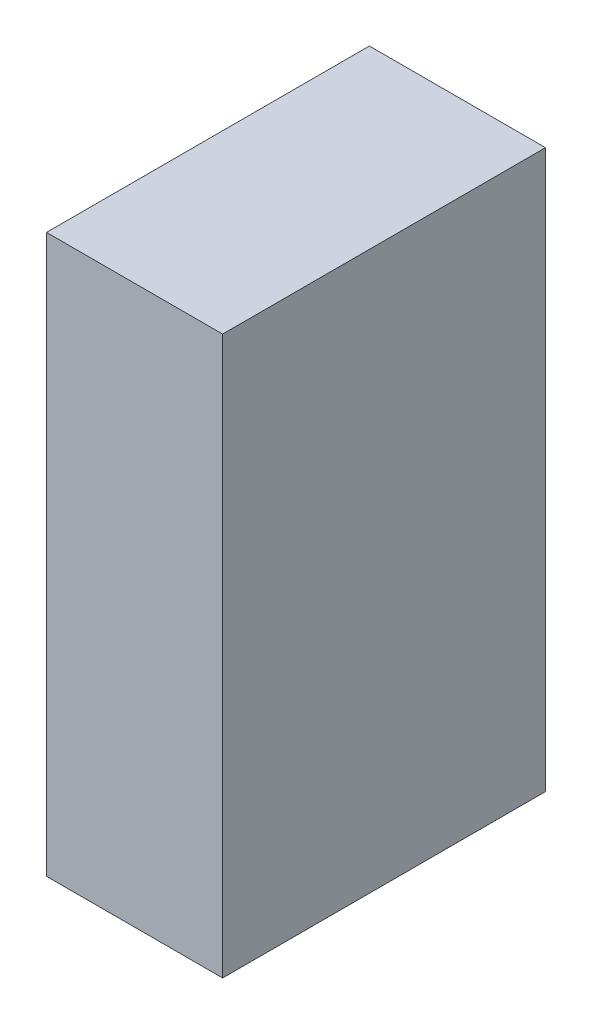
ISO-10303-21;
HEADER;
FILE_DESCRIPTION(('STEP AP214'),'2;1');
FILE_NAME('part.step','',(''),(''),'','','');
FILE_SCHEMA(('AUTOMOTIVE_DESIGN { 1 0 10303 214 1 1 1 1 }'));
ENDSEC;
DATA;
#1=APPLICATION_CONTEXT('core data for automotive mechanical design processes');
#2=APPLICATION_PROTOCOL_DEFINITION('international standard','automotive_design',2000,#1);
#3=PRODUCT_CONTEXT('',#1,'mechanical');
#4=PRODUCT('Part','Part','',(#3));
#5=PRODUCT_RELATED_PRODUCT_CATEGORY('part','',(#4));
#6=PRODUCT_DEFINITION_FORMATION('','',#4);
#7=PRODUCT_DEFINITION_CONTEXT('part definition',#1,'design');
#8=PRODUCT_DEFINITION('design','',#6,#7);
#9=PRODUCT_DEFINITION_SHAPE('','',#8);
#10=(LENGTH_UNIT() NAMED_UNIT(*) SI_UNIT(.MILLI.,.METRE.));
#11=(NAMED_UNIT(*) PLANE_ANGLE_UNIT() SI_UNIT($,.RADIAN.));
#12=(NAMED_UNIT(*) SI_UNIT($,.STERADIAN.) SOLID_ANGLE_UNIT());
#13=UNCERTAINTY_MEASURE_WITH_UNIT(LENGTH_MEASURE(1.E-05),#10,'distance_accuracy_value','');
#14=(GEOMETRIC_REPRESENTATION_CONTEXT(3) GLOBAL_UNCERTAINTY_ASSIGNED_CONTEXT((#13)) GLOBAL_UNIT_ASSIGNED_CONTEXT((#10,
#11,#12)) REPRESENTATION_CONTEXT('',''));
#15=CARTESIAN_POINT('',(0.,0.,0.));
#16=DIRECTION('',(0.,0.,1.));
#17=DIRECTION('',(1.,0.,0.));
#18=AXIS2_PLACEMENT_3D('',#15,#16,#17);
#19=CARTESIAN_POINT('',(54.649987932969,17.199991504727,-0.961478888988));
#20=DIRECTION('',(-1.,0.,0.));
#21=DIRECTION('',(0.,0.,1.));
#22=AXIS2_PLACEMENT_3D('',#19,#20,#21);
#23=PLANE('',#22);
#24=DIRECTION('',(0.,0.,1.));
#25=VECTOR('',#24,1.);
#26=CARTESIAN_POINT('',(54.649987932969,18.149992144727,-0.961478888988));
#27=LINE('',#26,#25);
#28=CARTESIAN_POINT('',(54.649987932969,18.149992144727,-0.961478888988));
#29=VERTEX_POINT('',#28);
#30=CARTESIAN_POINT('',(54.649987932969,18.149992144727,-0.411479988988));
#31=VERTEX_POINT('',#30);
#32=EDGE_CURVE('E20',#29,#31,#27,.T.);
#33=ORIENTED_EDGE('',*,*,#32,.F.);
#34=DIRECTION('',(0.,1.,0.));
#35=VECTOR('',#34,1.);
#36=CARTESIAN_POINT('',(54.649987932969,17.674991824727,-0.961478888988));
#37=LINE('',#36,#35);
#38=CARTESIAN_POINT('',(54.649987932969,17.199991504727,-0.961478888988));
#39=VERTEX_POINT('',#38);
#40=EDGE_CURVE('E80',#39,#29,#37,.T.);
#41=ORIENTED_EDGE('',*,*,#40,.F.);
#42=DIRECTION('',(0.,0.,-1.));
#43=VECTOR('',#42,1.);
#44=CARTESIAN_POINT('',(54.649987932969,17.199991504727,-0.961478888988));
#45=LINE('',#44,#43);
#46=CARTESIAN_POINT('',(54.649987932969,17.199991504727,-0.411479988988));
#47=VERTEX_POINT('',#46);
#48=EDGE_CURVE('E61',#47,#39,#45,.T.);
#49=ORIENTED_EDGE('',*,*,#48,.F.);
#50=DIRECTION('',(0.,1.,0.));
#51=VECTOR('',#50,1.);
#52=CARTESIAN_POINT('',(54.649987932969,17.674991824727,-0.411479988988));
#53=LINE('',#52,#51);
#54=EDGE_CURVE('E55',#47,#31,#53,.T.);
#55=ORIENTED_EDGE('',*,*,#54,.T.);
#56=EDGE_LOOP('',(#33,#41,#49,#55));
#57=FACE_BOUND('',#56,.T.);
#58=ADVANCED_FACE('F17',(#57),#23,.T.);
#59=CARTESIAN_POINT('',(54.649987932969,18.149992144727,-0.961478888988));
#60=DIRECTION('',(0.,1.,0.));
#61=DIRECTION('',(0.,0.,1.));
#62=AXIS2_PLACEMENT_3D('',#59,#60,#61);
#63=PLANE('',#62);
#64=DIRECTION('',(0.,0.,-1.));
#65=VECTOR('',#64,1.);
#66=CARTESIAN_POINT('',(54.949987332969,18.149992144727,-0.961478888988));
#67=LINE('',#66,#65);
#68=CARTESIAN_POINT('',(54.949987332969,18.149992144727,-0.961478888988));
#69=VERTEX_POINT('',#68);
#70=CARTESIAN_POINT('',(54.949987332969,18.149992144727,-0.411479988988));
#71=VERTEX_POINT('',#70);
#72=EDGE_CURVE('E83',#69,#71,#67,.F.);
#73=ORIENTED_EDGE('',*,*,#72,.F.);
#74=DIRECTION('',(-1.,0.,0.));
#75=VECTOR('',#74,1.);
#76=CARTESIAN_POINT('',(54.799987632969,18.149992144727,-0.961478888988));
#77=LINE('',#76,#75);
#78=EDGE_CURVE('E68',#29,#69,#77,.F.);
#79=ORIENTED_EDGE('',*,*,#78,.F.);
#80=ORIENTED_EDGE('',*,*,#32,.T.);
#81=DIRECTION('',(-1.,0.,0.));
#82=VECTOR('',#81,1.);
#83=CARTESIAN_POINT('',(54.799987632969,18.149992144727,-0.411479988988));
#84=LINE('',#83,#82);
#85=EDGE_CURVE('E63',#31,#71,#84,.F.);
#86=ORIENTED_EDGE('',*,*,#85,.T.);
#87=EDGE_LOOP('',(#73,#79,#80,#86));
#88=FACE_BOUND('',#87,.T.);
#89=ADVANCED_FACE('F65',(#88),#63,.T.);
#90=CARTESIAN_POINT('',(54.799987632969,17.674991824727,-0.411479988988));
#91=DIRECTION('',(0.,0.,-1.));
#92=DIRECTION('',(-1.,0.,0.));
#93=AXIS2_PLACEMENT_3D('',#90,#91,#92);
#94=PLANE('',#93);
#95=ORIENTED_EDGE('',*,*,#54,.F.);
#96=DIRECTION('',(1.,0.,0.));
#97=VECTOR('',#96,1.);
#98=CARTESIAN_POINT('',(54.949987332969,17.199991504727,-0.411479988988));
#99=LINE('',#98,#97);
#100=CARTESIAN_POINT('',(54.949987332969,17.199991504727,-0.411479988988));
#101=VERTEX_POINT('',#100);
#102=EDGE_CURVE('E74',#101,#47,#99,.F.);
#103=ORIENTED_EDGE('',*,*,#102,.F.);
#104=DIRECTION('',(0.,1.,0.));
#105=VECTOR('',#104,1.);
#106=CARTESIAN_POINT('',(54.949987332969,18.149992144727,-0.411479988988));
#107=LINE('',#106,#105);
#108=EDGE_CURVE('E72',#71,#101,#107,.F.);
#109=ORIENTED_EDGE('',*,*,#108,.F.);
#110=ORIENTED_EDGE('',*,*,#85,.F.);
#111=EDGE_LOOP('',(#95,#103,#109,#110));
#112=FACE_BOUND('',#111,.T.);
#113=ADVANCED_FACE('F70',(#112),#94,.F.);
#114=CARTESIAN_POINT('',(54.949987332969,17.199991504727,-0.961478888988));
#115=DIRECTION('',(0.,-1.,0.));
#116=DIRECTION('',(0.,0.,-1.));
#117=AXIS2_PLACEMENT_3D('',#114,#115,#116);
#118=PLANE('',#117);
#119=ORIENTED_EDGE('',*,*,#48,.T.);
#120=DIRECTION('',(-1.,0.,0.));
#121=VECTOR('',#120,1.);
#122=CARTESIAN_POINT('',(54.799987632969,17.199991504727,-0.961478888988));
#123=LINE('',#122,#121);
#124=CARTESIAN_POINT('',(54.949987332969,17.199991504727,-0.961478888988));
#125=VERTEX_POINT('',#124);
#126=EDGE_CURVE('E35',#125,#39,#123,.T.);
#127=ORIENTED_EDGE('',*,*,#126,.F.);
#128=DIRECTION('',(0.,0.,-1.));
#129=VECTOR('',#128,1.);
#130=CARTESIAN_POINT('',(54.949987332969,17.199991504727,-0.961478888988));
#131=LINE('',#130,#129);
#132=EDGE_CURVE('E26',#101,#125,#131,.T.);
#133=ORIENTED_EDGE('',*,*,#132,.F.);
#134=ORIENTED_EDGE('',*,*,#102,.T.);
#135=EDGE_LOOP('',(#119,#127,#133,#134));
#136=FACE_BOUND('',#135,.T.);
#137=ADVANCED_FACE('F89',(#136),#118,.T.);
#138=CARTESIAN_POINT('',(54.799987632969,17.674991824727,-0.961478888988));
#139=DIRECTION('',(0.,0.,-1.));
#140=DIRECTION('',(-1.,0.,0.));
#141=AXIS2_PLACEMENT_3D('',#138,#139,#140);
#142=PLANE('',#141);
#143=ORIENTED_EDGE('',*,*,#40,.T.);
#144=ORIENTED_EDGE('',*,*,#78,.T.);
#145=DIRECTION('',(0.,1.,0.));
#146=VECTOR('',#145,1.);
#147=CARTESIAN_POINT('',(54.949987332969,18.149992144727,-0.961478888988));
#148=LINE('',#147,#146);
#149=EDGE_CURVE('E11',#125,#69,#148,.T.);
#150=ORIENTED_EDGE('',*,*,#149,.F.);
#151=ORIENTED_EDGE('',*,*,#126,.T.);
#152=EDGE_LOOP('',(#143,#144,#150,#151));
#153=FACE_BOUND('',#152,.T.);
#154=ADVANCED_FACE('F91',(#153),#142,.T.);
#155=CARTESIAN_POINT('',(54.949987332969,18.149992144727,-0.961478888988));
#156=DIRECTION('',(1.,0.,0.));
#157=DIRECTION('',(0.,0.,-1.));
#158=AXIS2_PLACEMENT_3D('',#155,#156,#157);
#159=PLANE('',#158);
#160=ORIENTED_EDGE('',*,*,#132,.T.);
#161=ORIENTED_EDGE('',*,*,#149,.T.);
#162=ORIENTED_EDGE('',*,*,#72,.T.);
#163=ORIENTED_EDGE('',*,*,#108,.T.);
#164=EDGE_LOOP('',(#160,#161,#162,#163));
#165=FACE_BOUND('',#164,.T.);
#166=ADVANCED_FACE('F88',(#165),#159,.T.);
#167=CLOSED_SHELL('',(#58,#89,#113,#137,#154,#166));
#168=MANIFOLD_SOLID_BREP('B1',#167);
#169=ADVANCED_BREP_SHAPE_REPRESENTATION('',(#18,#168),#14);
#170=SHAPE_DEFINITION_REPRESENTATION(#9,#169);
ENDSEC;
END-ISO-10303-21;
